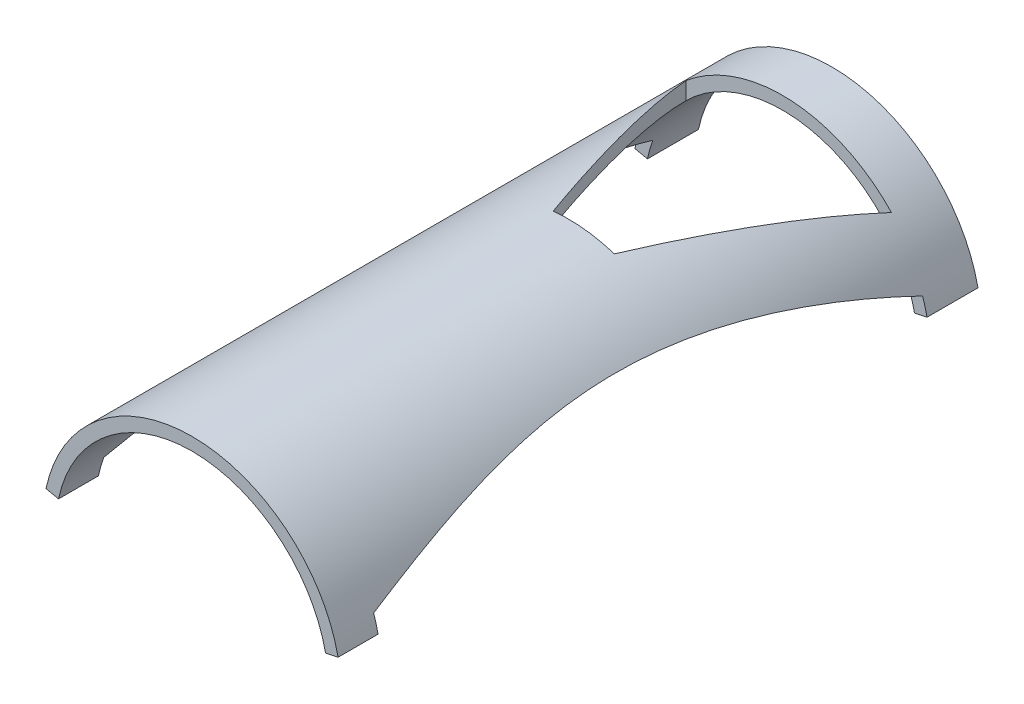
ISO-10303-21;
HEADER;
FILE_DESCRIPTION(('STEP AP214'),'2;1');
FILE_NAME('part.step','',(''),(''),'','','');
FILE_SCHEMA(('AUTOMOTIVE_DESIGN { 1 0 10303 214 1 1 1 1 }'));
ENDSEC;
DATA;
#1=APPLICATION_CONTEXT('core data for automotive mechanical design processes');
#2=APPLICATION_PROTOCOL_DEFINITION('international standard','automotive_design',2000,#1);
#3=PRODUCT_CONTEXT('',#1,'mechanical');
#4=PRODUCT('Part','Part','',(#3));
#5=PRODUCT_RELATED_PRODUCT_CATEGORY('part','',(#4));
#6=PRODUCT_DEFINITION_FORMATION('','',#4);
#7=PRODUCT_DEFINITION_CONTEXT('part definition',#1,'design');
#8=PRODUCT_DEFINITION('design','',#6,#7);
#9=PRODUCT_DEFINITION_SHAPE('','',#8);
#10=(LENGTH_UNIT() NAMED_UNIT(*) SI_UNIT(.MILLI.,.METRE.));
#11=(NAMED_UNIT(*) PLANE_ANGLE_UNIT() SI_UNIT($,.RADIAN.));
#12=(NAMED_UNIT(*) SI_UNIT($,.STERADIAN.) SOLID_ANGLE_UNIT());
#13=UNCERTAINTY_MEASURE_WITH_UNIT(LENGTH_MEASURE(1.E-05),#10,'distance_accuracy_value','');
#14=(GEOMETRIC_REPRESENTATION_CONTEXT(3) GLOBAL_UNCERTAINTY_ASSIGNED_CONTEXT((#13)) GLOBAL_UNIT_ASSIGNED_CONTEXT((#10,
#11,#12)) REPRESENTATION_CONTEXT('',''));
#15=CARTESIAN_POINT('',(0.,0.,0.));
#16=DIRECTION('',(0.,0.,1.));
#17=DIRECTION('',(1.,0.,0.));
#18=AXIS2_PLACEMENT_3D('',#15,#16,#17);
#19=CARTESIAN_POINT('',(-34.2351660256832,7.27690917862159,150.));
#20=DIRECTION('',(0.207911690817759,0.978147600733806,0.));
#21=DIRECTION('',(-0.978147600733806,0.207911690817759,0.));
#22=AXIS2_PLACEMENT_3D('',#19,#20,#21);
#23=PLANE('',#22);
#24=DIRECTION('',(0.,0.,-1.));
#25=VECTOR('',#24,1.);
#26=CARTESIAN_POINT('',(-31.3007232234818,6.65317410616831,150.));
#27=LINE('',#26,#25);
#28=CARTESIAN_POINT('',(-31.3007232234818,6.65317410616831,11.9530939235805));
#29=VERTEX_POINT('',#28);
#30=CARTESIAN_POINT('',(-31.3007232234818,6.65317410616831,0.));
#31=VERTEX_POINT('',#30);
#32=EDGE_CURVE('E255',#29,#31,#27,.T.);
#33=ORIENTED_EDGE('',*,*,#32,.F.);
#34=DIRECTION('',(-0.978147600733806,0.207911690817759,0.));
#35=VECTOR('',#34,1.);
#36=CARTESIAN_POINT('',(-34.2351660256832,7.27690917862159,11.9530939235805));
#37=LINE('',#36,#35);
#38=CARTESIAN_POINT('',(-34.2351660256832,7.27690917862159,11.9530939235805));
#39=VERTEX_POINT('',#38);
#40=EDGE_CURVE('E201',#29,#39,#37,.T.);
#41=ORIENTED_EDGE('',*,*,#40,.T.);
#42=DIRECTION('',(0.,0.,-1.));
#43=VECTOR('',#42,1.);
#44=CARTESIAN_POINT('',(-34.2351660256832,7.27690917862159,150.));
#45=LINE('',#44,#43);
#46=CARTESIAN_POINT('',(-34.2351660256832,7.27690917862159,0.));
#47=VERTEX_POINT('',#46);
#48=EDGE_CURVE('E268',#39,#47,#45,.T.);
#49=ORIENTED_EDGE('',*,*,#48,.T.);
#50=DIRECTION('',(0.978147600733806,-0.207911690817759,0.));
#51=VECTOR('',#50,1.);
#52=CARTESIAN_POINT('',(-34.2351660256832,7.27690917862159,0.));
#53=LINE('',#52,#51);
#54=EDGE_CURVE('E257',#47,#31,#53,.T.);
#55=ORIENTED_EDGE('',*,*,#54,.T.);
#56=EDGE_LOOP('',(#33,#41,#49,#55));
#57=FACE_BOUND('',#56,.T.);
#58=ADVANCED_FACE('F39',(#57),#23,.F.);
#59=CARTESIAN_POINT('',(31.3007232234818,6.65317410616831,150.));
#60=DIRECTION('',(-0.207911690817759,0.978147600733806,0.));
#61=DIRECTION('',(-0.978147600733806,-0.207911690817759,0.));
#62=AXIS2_PLACEMENT_3D('',#59,#60,#61);
#63=PLANE('',#62);
#64=DIRECTION('',(0.,0.,-1.));
#65=VECTOR('',#64,1.);
#66=CARTESIAN_POINT('',(34.2351660256832,7.27690917862159,150.));
#67=LINE('',#66,#65);
#68=CARTESIAN_POINT('',(34.2351660256832,7.27690917862159,11.9530939235805));
#69=VERTEX_POINT('',#68);
#70=CARTESIAN_POINT('',(34.2351660256832,7.27690917862159,0.));
#71=VERTEX_POINT('',#70);
#72=EDGE_CURVE('E298',#69,#71,#67,.T.);
#73=ORIENTED_EDGE('',*,*,#72,.F.);
#74=DIRECTION('',(-0.978147600733806,-0.207911690817759,0.));
#75=VECTOR('',#74,1.);
#76=CARTESIAN_POINT('',(31.3007232234818,6.65317410616831,11.9530939235805));
#77=LINE('',#76,#75);
#78=CARTESIAN_POINT('',(31.3007232234818,6.65317410616831,11.9530939235805));
#79=VERTEX_POINT('',#78);
#80=EDGE_CURVE('E227',#69,#79,#77,.T.);
#81=ORIENTED_EDGE('',*,*,#80,.T.);
#82=DIRECTION('',(0.,0.,-1.));
#83=VECTOR('',#82,1.);
#84=CARTESIAN_POINT('',(31.3007232234818,6.65317410616831,150.));
#85=LINE('',#84,#83);
#86=CARTESIAN_POINT('',(31.3007232234818,6.65317410616831,0.));
#87=VERTEX_POINT('',#86);
#88=EDGE_CURVE('E270',#79,#87,#85,.T.);
#89=ORIENTED_EDGE('',*,*,#88,.T.);
#90=DIRECTION('',(0.978147600733806,0.207911690817759,0.));
#91=VECTOR('',#90,1.);
#92=CARTESIAN_POINT('',(31.3007232234818,6.65317410616831,0.));
#93=LINE('',#92,#91);
#94=EDGE_CURVE('E312',#87,#71,#93,.T.);
#95=ORIENTED_EDGE('',*,*,#94,.T.);
#96=EDGE_LOOP('',(#73,#81,#89,#95));
#97=FACE_BOUND('',#96,.T.);
#98=ADVANCED_FACE('F245',(#97),#63,.F.);
#99=CARTESIAN_POINT('',(0.,0.,150.));
#100=DIRECTION('',(0.,0.,-1.));
#101=DIRECTION('',(-1.,0.,0.));
#102=AXIS2_PLACEMENT_3D('',#99,#100,#101);
#103=CYLINDRICAL_SURFACE('',#102,35.);
#104=CARTESIAN_POINT('',(33.2046490773948,11.0657706305103,140.636510433429));
#105=CARTESIAN_POINT('',(33.0532764336408,11.5199647534281,139.539531924796));
#106=CARTESIAN_POINT('',(32.8955467425113,11.9622148063761,138.438551105605));
#107=CARTESIAN_POINT('',(32.5697289345211,12.8228145565474,136.228854341505));
#108=CARTESIAN_POINT('',(32.4016412161139,13.2411651719449,135.120138695594));
#109=CARTESIAN_POINT('',(31.8854122211716,14.4602675983938,131.783030658858));
#110=CARTESIAN_POINT('',(31.5252540525955,15.2252185547421,129.543318192187));
#111=CARTESIAN_POINT('',(30.7904242921664,16.6613967718349,125.029465456095));
#112=CARTESIAN_POINT('',(30.415714927485,17.332355931446,122.755246420199));
#113=CARTESIAN_POINT('',(29.6714003315312,18.5777899882256,118.179587307883));
#114=CARTESIAN_POINT('',(29.3017952564287,19.1522619392639,115.878146402569));
#115=CARTESIAN_POINT('',(28.5913596708256,20.1972320746167,111.279519859467));
#116=CARTESIAN_POINT('',(28.2502176213313,20.6689845204681,108.982667652183));
#117=CARTESIAN_POINT('',(27.6098768074856,21.5169118242982,104.365361408686));
#118=CARTESIAN_POINT('',(27.3106778150004,21.8930872021423,102.044907500918));
#119=CARTESIAN_POINT('',(26.906903370342,22.3844405117167,98.5505490921763));
#120=CARTESIAN_POINT('',(26.7798833873723,22.535998968787,97.3842405521359));
#121=CARTESIAN_POINT('',(26.5427808275799,22.8147836156022,95.0470153437999));
#122=CARTESIAN_POINT('',(26.4326976088402,22.9420107275691,93.8760988518754));
#123=CARTESIAN_POINT('',(26.2313489633927,23.1719589414802,91.5302893374575));
#124=CARTESIAN_POINT('',(26.1400828540449,23.2746809324331,90.35539646079));
#125=CARTESIAN_POINT('',(25.9779886331242,23.455465915864,88.0023082988375));
#126=CARTESIAN_POINT('',(25.9071602491144,23.5335292370459,86.8241130577846));
#127=CARTESIAN_POINT('',(25.7958909566842,23.6553960836159,84.6352855066069));
#128=CARTESIAN_POINT('',(25.7525412809868,23.7025162655943,83.624983941683));
#129=CARTESIAN_POINT('',(25.6823673749474,23.7785343921254,81.6031243630142));
#130=CARTESIAN_POINT('',(25.6555430039085,23.8074324918213,80.5915663600402));
#131=CARTESIAN_POINT('',(25.6188014281703,23.8469650288753,78.5678112078323));
#132=CARTESIAN_POINT('',(25.608883803808,23.8575999195665,77.5556140750869));
#133=CARTESIAN_POINT('',(25.6060959705254,23.8605920696246,75.531166514253));
#134=CARTESIAN_POINT('',(25.6132258041536,23.8529492833725,74.5189160860377));
#135=CARTESIAN_POINT('',(25.6444361313408,23.8193916797705,72.4946561905714));
#136=CARTESIAN_POINT('',(25.6685220533122,23.7934710108375,71.482646904341));
#137=CARTESIAN_POINT('',(25.7333081420854,23.7233876034164,69.4597657009365));
#138=CARTESIAN_POINT('',(25.7740088095011,23.6792243152649,68.4488938189536));
#139=CARTESIAN_POINT('',(25.8714564347579,23.572716594113,66.4289043430169));
#140=CARTESIAN_POINT('',(25.9282030365474,23.5103725645337,65.4197867106371));
#141=CARTESIAN_POINT('',(26.0569600102666,23.3675841208154,63.403798349847));
#142=CARTESIAN_POINT('',(26.1289708642186,23.2871391350701,62.3969276934077));
#143=CARTESIAN_POINT('',(26.3665352298741,23.0187646522249,59.3801443467738));
#144=CARTESIAN_POINT('',(26.5536116006406,22.8038050929366,57.374239358492));
#145=CARTESIAN_POINT('',(26.9758531090951,22.3026956348501,53.3765596130217));
#146=CARTESIAN_POINT('',(27.2110193650542,22.0165440805364,51.3847851855366));
#147=CARTESIAN_POINT('',(27.7186300710471,21.373934285705,47.4176415788898));
#148=CARTESIAN_POINT('',(27.9910709351196,21.0174828068573,45.4422708409964));
#149=CARTESIAN_POINT('',(28.5618678164682,20.2349731025008,41.5091241061696));
#150=CARTESIAN_POINT('',(28.8602249391217,19.8089119073227,39.551348863651));
#151=CARTESIAN_POINT('',(29.5093742081075,18.8303765851985,35.4117881665667));
#152=CARTESIAN_POINT('',(29.8620700566164,18.2687682444044,33.2324576172323));
#153=CARTESIAN_POINT('',(30.5693319442945,17.0589213526471,28.8991881134835));
#154=CARTESIAN_POINT('',(30.9238972721528,16.4107137470145,26.7452403866027));
#155=CARTESIAN_POINT('',(31.6180394018998,15.0298040963613,22.4694897601109));
#156=CARTESIAN_POINT('',(31.9576587781619,14.2973668774225,20.3476086224144));
#157=CARTESIAN_POINT('',(32.4449022293486,13.1341224864333,17.1847107139915));
#158=CARTESIAN_POINT('',(32.6036545484304,12.7355061643378,16.1334821295929));
#159=CARTESIAN_POINT('',(32.9117287014795,11.916766704712,14.0379985101806));
#160=CARTESIAN_POINT('',(33.0610501802981,11.4966427583201,12.9937437391111));
#161=CARTESIAN_POINT('',(33.2046490773948,11.0657706305104,11.9530939235805));
#162=B_SPLINE_CURVE_WITH_KNOTS('',3,(#104,#105,#106,#107,#108,#109,#110,#111,#112,#113,#114,
#115,#116,#117,#118,#119,#120,#121,#122,#123,#124,#125,#126,#127,#128,#129,#130,#131,#132,#133,
#134,#135,#136,#137,#138,#139,#140,#141,#142,#143,#144,#145,#146,#147,#148,#149,#150,#151,#152,
#153,#154,#155,#156,#157,#158,#159,#160,#161),.UNSPECIFIED.,.F.,.F.,(4,2,2,2,2,2,2,2,2,2,2,2,2,
2,2,2,2,2,2,2,2,2,2,2,2,2,2,2,4),(0.,3.59050809061059,7.18087814734327,14.3604437854447,
21.5600885870374,28.7599531818799,35.8662447391547,42.9724976428745,46.5210462759864,
50.0694603830897,53.6177457395142,57.1659837947337,60.2026823050441,63.2393549604758,
66.2759522378803,69.3125570942847,72.3501345478954,75.3878035326021,78.4254051181619,
81.4631026409528,87.5390358214239,93.6151103063026,99.6906006598108,105.766350271819,
112.598488529975,119.428191893536,126.236980650649,129.643010400798,133.04916833962),.UNSPECIFIED.);
#163=CARTESIAN_POINT('',(33.2046490773948,11.0657706305103,140.636510433429));
#164=VERTEX_POINT('',#163);
#165=CARTESIAN_POINT('',(33.2046490773948,11.0657706305103,11.9530939235805));
#166=VERTEX_POINT('',#165);
#167=EDGE_CURVE('E187',#164,#166,#162,.T.);
#168=ORIENTED_EDGE('',*,*,#167,.T.);
#169=CARTESIAN_POINT('',(0.,0.,11.9530939235805));
#170=DIRECTION('',(0.,0.,-1.));
#171=DIRECTION('',(-1.,0.,0.));
#172=AXIS2_PLACEMENT_3D('',#169,#170,#171);
#173=CIRCLE('',#172,35.);
#174=EDGE_CURVE('E195',#166,#69,#173,.T.);
#175=ORIENTED_EDGE('',*,*,#174,.T.);
#176=ORIENTED_EDGE('',*,*,#72,.T.);
#177=CARTESIAN_POINT('',(0.,0.,0.));
#178=DIRECTION('',(0.,0.,1.));
#179=DIRECTION('',(1.,0.,0.));
#180=AXIS2_PLACEMENT_3D('',#177,#178,#179);
#181=CIRCLE('',#180,35.);
#182=EDGE_CURVE('E320',#71,#47,#181,.T.);
#183=ORIENTED_EDGE('',*,*,#182,.T.);
#184=ORIENTED_EDGE('',*,*,#48,.F.);
#185=CARTESIAN_POINT('',(-33.2046490773948,11.0657706305103,11.9530939235805));
#186=VERTEX_POINT('',#185);
#187=EDGE_CURVE('E185',#39,#186,#173,.T.);
#188=ORIENTED_EDGE('',*,*,#187,.T.);
#189=CARTESIAN_POINT('',(-33.2046490773948,11.0657706305103,11.9530939235805));
#190=CARTESIAN_POINT('',(-33.0532764336408,11.5199647534281,13.0500724322133));
#191=CARTESIAN_POINT('',(-32.8955467425113,11.9622148063761,14.1510532514048));
#192=CARTESIAN_POINT('',(-32.5697289345211,12.8228145565474,16.3607500155046));
#193=CARTESIAN_POINT('',(-32.4016412161139,13.2411651719449,17.4694656614157));
#194=CARTESIAN_POINT('',(-31.8854122211716,14.4602675983939,20.8065736981517));
#195=CARTESIAN_POINT('',(-31.5252540525955,15.2252185547421,23.0462861648228));
#196=CARTESIAN_POINT('',(-30.7904242921664,16.6613967718349,27.5601389009139));
#197=CARTESIAN_POINT('',(-30.415714927485,17.332355931446,29.8343579368101));
#198=CARTESIAN_POINT('',(-29.6714003315312,18.5777899882256,34.4100170491263));
#199=CARTESIAN_POINT('',(-29.3017952564287,19.1522619392638,36.7114579544401));
#200=CARTESIAN_POINT('',(-28.5913596708256,20.1972320746167,41.3100844975427));
#201=CARTESIAN_POINT('',(-28.2502176213312,20.6689845204682,43.6069367048261));
#202=CARTESIAN_POINT('',(-27.6098768074856,21.5169118242983,48.2242429483236));
#203=CARTESIAN_POINT('',(-27.3106778150004,21.8930872021422,50.5446968560911));
#204=CARTESIAN_POINT('',(-26.906903370342,22.3844405117168,54.039055264833));
#205=CARTESIAN_POINT('',(-26.7798833873722,22.5359989687871,55.2053638048735));
#206=CARTESIAN_POINT('',(-26.5427808275799,22.8147836156022,57.5425890132094));
#207=CARTESIAN_POINT('',(-26.4326976088403,22.9420107275691,58.7135055051339));
#208=CARTESIAN_POINT('',(-26.2313489633928,23.1719589414801,61.0593150195519));
#209=CARTESIAN_POINT('',(-26.1400828540449,23.2746809324331,62.2342078962194));
#210=CARTESIAN_POINT('',(-25.9779886331243,23.455465915864,64.5872960581719));
#211=CARTESIAN_POINT('',(-25.9071602491144,23.5335292370459,65.7654912992247));
#212=CARTESIAN_POINT('',(-25.7958909566842,23.6553960836159,67.9543188504024));
#213=CARTESIAN_POINT('',(-25.7525412809868,23.7025162655943,68.9646204153264));
#214=CARTESIAN_POINT('',(-25.6823673749474,23.7785343921254,70.9864799939951));
#215=CARTESIAN_POINT('',(-25.6555430039085,23.8074324918214,71.9980379969691));
#216=CARTESIAN_POINT('',(-25.6188014281703,23.8469650288753,74.0217931491771));
#217=CARTESIAN_POINT('',(-25.608883803808,23.8575999195665,75.0339902819225));
#218=CARTESIAN_POINT('',(-25.6060959705254,23.8605920696246,77.0584378427564));
#219=CARTESIAN_POINT('',(-25.6132258041536,23.8529492833725,78.0706882709716));
#220=CARTESIAN_POINT('',(-25.6444361313408,23.8193916797705,80.0949481664379));
#221=CARTESIAN_POINT('',(-25.6685220533122,23.7934710108375,81.1069574526683));
#222=CARTESIAN_POINT('',(-25.7333081420854,23.7233876034164,83.1298386560728));
#223=CARTESIAN_POINT('',(-25.774008809501,23.6792243152649,84.1407105380558));
#224=CARTESIAN_POINT('',(-25.8714564347579,23.5727165941131,86.1607000139924));
#225=CARTESIAN_POINT('',(-25.9282030365474,23.5103725645337,87.1698176463723));
#226=CARTESIAN_POINT('',(-26.0569600102666,23.3675841208154,89.1858060071624));
#227=CARTESIAN_POINT('',(-26.1289708642186,23.2871391350701,90.1926766636016));
#228=CARTESIAN_POINT('',(-26.3665352298741,23.018764652225,93.2094600102356));
#229=CARTESIAN_POINT('',(-26.5536116006406,22.8038050929366,95.2153649985173));
#230=CARTESIAN_POINT('',(-26.9758531090951,22.3026956348501,99.2130447439876));
#231=CARTESIAN_POINT('',(-27.2110193650542,22.0165440805364,101.204819171473));
#232=CARTESIAN_POINT('',(-27.7186300710471,21.373934285705,105.17196277812));
#233=CARTESIAN_POINT('',(-27.9910709351196,21.0174828068573,107.147333516013));
#234=CARTESIAN_POINT('',(-28.5618678164682,20.2349731025008,111.08048025084));
#235=CARTESIAN_POINT('',(-28.8602249391217,19.8089119073227,113.038255493358));
#236=CARTESIAN_POINT('',(-29.5093742081075,18.8303765851985,117.177816190443));
#237=CARTESIAN_POINT('',(-29.8620700566164,18.2687682444044,119.357146739777));
#238=CARTESIAN_POINT('',(-30.5693319442945,17.0589213526471,123.690416243526));
#239=CARTESIAN_POINT('',(-30.9238972721528,16.4107137470145,125.844363970407));
#240=CARTESIAN_POINT('',(-31.6180394018998,15.0298040963613,130.120114596898));
#241=CARTESIAN_POINT('',(-31.9576587781619,14.2973668774225,132.241995734595));
#242=CARTESIAN_POINT('',(-32.4449022293486,13.1341224864333,135.404893643018));
#243=CARTESIAN_POINT('',(-32.6036545484304,12.7355061643378,136.456122227416));
#244=CARTESIAN_POINT('',(-32.9117287014795,11.916766704712,138.551605846829));
#245=CARTESIAN_POINT('',(-33.0610501802981,11.4966427583201,139.595860617898));
#246=CARTESIAN_POINT('',(-33.2046490773948,11.0657706305103,140.636510433429));
#247=B_SPLINE_CURVE_WITH_KNOTS('',3,(#189,#190,#191,#192,#193,#194,#195,#196,#197,#198,#199,
#200,#201,#202,#203,#204,#205,#206,#207,#208,#209,#210,#211,#212,#213,#214,#215,#216,#217,#218,
#219,#220,#221,#222,#223,#224,#225,#226,#227,#228,#229,#230,#231,#232,#233,#234,#235,#236,#237,
#238,#239,#240,#241,#242,#243,#244,#245,#246),.UNSPECIFIED.,.F.,.F.,(4,2,2,2,2,2,2,2,2,2,2,2,2,
2,2,2,2,2,2,2,2,2,2,2,2,2,2,2,4),(0.,3.59050809061058,7.18087814734327,14.3604437854447,
21.5600885870373,28.7599531818798,35.8662447391546,42.9724976428745,46.5210462759864,
50.0694603830896,53.6177457395142,57.1659837947337,60.2026823050441,63.2393549604758,
66.2759522378802,69.3125570942847,72.3501345478954,75.3878035326021,78.4254051181619,
81.4631026409529,87.5390358214239,93.6151103063026,99.6906006598108,105.766350271819,
112.598488529975,119.428191893536,126.236980650649,129.643010400798,133.04916833962),.UNSPECIFIED.);
#248=CARTESIAN_POINT('',(-33.2046490773948,11.0657706305103,140.636510433429));
#249=VERTEX_POINT('',#248);
#250=EDGE_CURVE('E175',#186,#249,#247,.T.);
#251=ORIENTED_EDGE('',*,*,#250,.T.);
#252=CARTESIAN_POINT('',(0.,0.,140.636510433429));
#253=DIRECTION('',(0.,0.,1.));
#254=DIRECTION('',(1.,0.,0.));
#255=AXIS2_PLACEMENT_3D('',#252,#253,#254);
#256=CIRCLE('',#255,35.);
#257=CARTESIAN_POINT('',(-34.2351660256832,7.27690917862159,140.636510433429));
#258=VERTEX_POINT('',#257);
#259=EDGE_CURVE('E160',#249,#258,#256,.T.);
#260=ORIENTED_EDGE('',*,*,#259,.T.);
#261=CARTESIAN_POINT('',(-34.2351660256832,7.27690917862159,150.));
#262=VERTEX_POINT('',#261);
#263=EDGE_CURVE('E274',#262,#258,#45,.T.);
#264=ORIENTED_EDGE('',*,*,#263,.F.);
#265=CARTESIAN_POINT('',(0.,0.,150.));
#266=DIRECTION('',(0.,0.,1.));
#267=DIRECTION('',(1.,0.,0.));
#268=AXIS2_PLACEMENT_3D('',#265,#266,#267);
#269=CIRCLE('',#268,35.);
#270=CARTESIAN_POINT('',(34.2351660256832,7.27690917862159,150.));
#271=VERTEX_POINT('',#270);
#272=EDGE_CURVE('E315',#271,#262,#269,.T.);
#273=ORIENTED_EDGE('',*,*,#272,.F.);
#274=CARTESIAN_POINT('',(34.2351660256832,7.27690917862159,140.636510433429));
#275=VERTEX_POINT('',#274);
#276=EDGE_CURVE('E306',#271,#275,#67,.T.);
#277=ORIENTED_EDGE('',*,*,#276,.T.);
#278=EDGE_CURVE('E70',#275,#164,#256,.T.);
#279=ORIENTED_EDGE('',*,*,#278,.T.);
#280=EDGE_LOOP('',(#168,#175,#176,#183,#184,#188,#251,#260,#264,#273,#277,#279));
#281=FACE_BOUND('',#280,.T.);
#282=CARTESIAN_POINT('',(0.,0.,11.5546932532715));
#283=DIRECTION('',(0.,0.,1.));
#284=DIRECTION('',(1.,0.,0.));
#285=AXIS2_PLACEMENT_3D('',#282,#283,#284);
#286=CIRCLE('',#285,35.);
#287=CARTESIAN_POINT('',(25.4976428997842,23.9764510834086,11.5546932532715));
#288=VERTEX_POINT('',#287);
#289=CARTESIAN_POINT('',(-22.7088382076203,26.6328494018219,11.5546932532715));
#290=VERTEX_POINT('',#289);
#291=EDGE_CURVE('E344',#288,#290,#286,.T.);
#292=ORIENTED_EDGE('',*,*,#291,.F.);
#293=CARTESIAN_POINT('',(0.,0.,98.3845042092934));
#294=DIRECTION('',(-0.959486670527062,0.,-0.281754022297629));
#295=DIRECTION('',(0.281754022297629,0.,-0.959486670527062));
#296=AXIS2_PLACEMENT_3D('',#293,#294,#295);
#297=ELLIPSE('',#296,124.221829078372,35.);
#298=CARTESIAN_POINT('',(10.7568180983465,33.3060184411029,61.7531777122216));
#299=VERTEX_POINT('',#298);
#300=EDGE_CURVE('E341',#299,#288,#297,.T.);
#301=ORIENTED_EDGE('',*,*,#300,.F.);
#302=CARTESIAN_POINT('',(0.,0.,61.7531777122216));
#303=DIRECTION('',(0.,0.,-1.));
#304=DIRECTION('',(-1.,0.,0.));
#305=AXIS2_PLACEMENT_3D('',#302,#303,#304);
#306=CIRCLE('',#305,35.);
#307=CARTESIAN_POINT('',(-3.58560603278213,34.8158502607315,61.7531777122216));
#308=VERTEX_POINT('',#307);
#309=EDGE_CURVE('E338',#308,#299,#306,.T.);
#310=ORIENTED_EDGE('',*,*,#309,.F.);
#311=CARTESIAN_POINT('',(0.,0.,71.1653935482747));
#312=DIRECTION('',(0.934487734928968,0.,-0.355995327591988));
#313=DIRECTION('',(-0.355995327591988,0.,-0.934487734928968));
#314=AXIS2_PLACEMENT_3D('',#311,#312,#313);
#315=ELLIPSE('',#314,98.3158971123185,35.);
#316=EDGE_CURVE('E324',#290,#308,#315,.T.);
#317=ORIENTED_EDGE('',*,*,#316,.F.);
#318=EDGE_LOOP('',(#292,#301,#310,#317));
#319=FACE_BOUND('',#318,.T.);
#320=ADVANCED_FACE('F41',(#281,#319),#103,.T.);
#321=CARTESIAN_POINT('',(0.,0.,150.));
#322=DIRECTION('',(0.,0.,-1.));
#323=DIRECTION('',(-1.,0.,0.));
#324=AXIS2_PLACEMENT_3D('',#321,#322,#323);
#325=CYLINDRICAL_SURFACE('',#324,32.);
#326=CARTESIAN_POINT('',(-30.0258009110987,11.0657706305103,140.636510433429));
#327=CARTESIAN_POINT('',(-29.8586573853052,11.5192734962577,139.541200983048));
#328=CARTESIAN_POINT('',(-29.6842806127991,11.9607858336793,138.44210250506));
#329=CARTESIAN_POINT('',(-29.3235179154583,12.8198459750017,136.236593620417));
#330=CARTESIAN_POINT('',(-29.1371325718386,13.2373949368837,135.130183569966));
#331=CARTESIAN_POINT('',(-28.5637094255284,14.4540040596603,131.80072253757));
#332=CARTESIAN_POINT('',(-28.1623275086501,15.217229388798,129.566950272191));
#333=CARTESIAN_POINT('',(-27.3393302241916,16.6507168357587,125.064495359258));
#334=CARTESIAN_POINT('',(-26.917647262066,17.3206346442035,122.795716031756));
#335=CARTESIAN_POINT('',(-26.0754587872309,18.5643303305162,118.231579095762));
#336=CARTESIAN_POINT('',(-25.6549533314295,19.1381036380176,115.936220229315));
#337=CARTESIAN_POINT('',(-24.8435159648057,20.1798913981738,111.359875676757));
#338=CARTESIAN_POINT('',(-24.4521955734081,20.6495793177637,109.079340186606));
#339=CARTESIAN_POINT('',(-23.7125393460342,21.4949139207797,104.493712649819));
#340=CARTESIAN_POINT('',(-23.3642035551674,21.8705605055161,102.188620577417));
#341=CARTESIAN_POINT('',(-22.8907220462364,22.3621648921368,98.7163822199746));
#342=CARTESIAN_POINT('',(-22.7411722315528,22.5139562638419,97.557533212831));
#343=CARTESIAN_POINT('',(-22.4609063184523,22.7935717503738,95.2346925274496));
#344=CARTESIAN_POINT('',(-22.3301894017456,22.9213969066061,94.0707010749174));
#345=CARTESIAN_POINT('',(-22.0900951575564,23.1528726987712,91.7381934242287));
#346=CARTESIAN_POINT('',(-21.980716429813,23.2565249210746,90.5696775281121));
#347=CARTESIAN_POINT('',(-21.7855287996959,23.4394682530733,88.2287765168062));
#348=CARTESIAN_POINT('',(-21.6997194309723,23.5187598447784,87.0563914786374));
#349=CARTESIAN_POINT('',(-21.5663870219902,23.6410149152747,84.9152345056177));
#350=CARTESIAN_POINT('',(-21.5147837636001,23.687915854909,83.9469387219337));
#351=CARTESIAN_POINT('',(-21.4296247312552,23.7649847838871,82.0088931869141));
#352=CARTESIAN_POINT('',(-21.3960687116521,23.795153000987,81.0391434555489));
#353=CARTESIAN_POINT('',(-21.3475351335102,23.8387039741499,79.0988300063967));
#354=CARTESIAN_POINT('',(-21.3325570240868,23.8520872279321,78.1282663136));
#355=CARTESIAN_POINT('',(-21.3214167832116,23.8620460917791,76.1869411665884));
#356=CARTESIAN_POINT('',(-21.3252547049698,23.8586216543135,75.2161797118221));
#357=CARTESIAN_POINT('',(-21.3516900691578,23.8349668534249,73.2747679791176));
#358=CARTESIAN_POINT('',(-21.3742942770236,23.8147304291088,72.3041178675544));
#359=CARTESIAN_POINT('',(-21.4379095781381,23.7574799574971,70.363921039539));
#360=CARTESIAN_POINT('',(-21.4789206647578,23.7204659162438,69.3943743226896));
#361=CARTESIAN_POINT('',(-21.5787113619441,23.629722301472,67.4569802325663));
#362=CARTESIAN_POINT('',(-21.6374909547305,23.5759927446801,66.4891328575928));
#363=CARTESIAN_POINT('',(-21.7719198378158,23.4519038130336,64.5556674720958));
#364=CARTESIAN_POINT('',(-21.8475697183154,23.3815438563653,63.5900495407631));
#365=CARTESIAN_POINT('',(-22.0983201691025,23.1455717936963,60.6961520832489));
#366=CARTESIAN_POINT('',(-22.2971659073516,22.9551162929356,58.7718677957742));
#367=CARTESIAN_POINT('',(-22.7475031117744,22.5089111679025,54.9372380474604));
#368=CARTESIAN_POINT('',(-22.9989958078703,22.2531600181823,53.0268929133427));
#369=CARTESIAN_POINT('',(-23.5426316016123,21.677204401555,49.221629961657));
#370=CARTESIAN_POINT('',(-23.8347787420459,21.3569935231825,47.3267136982389));
#371=CARTESIAN_POINT('',(-24.4474334949458,20.6528622434669,43.5535588220292));
#372=CARTESIAN_POINT('',(-24.7679398797311,20.2689445993813,41.6753194911573));
#373=CARTESIAN_POINT('',(-25.5155255179072,19.3239094665493,37.4230588285926));
#374=CARTESIAN_POINT('',(-25.9477303734132,18.7430684891071,35.0543045276021));
#375=CARTESIAN_POINT('',(-26.8152085548045,17.4794697375481,30.3458953578438));
#376=CARTESIAN_POINT('',(-27.2504805164203,16.7967548491894,28.0062286909225));
#377=CARTESIAN_POINT('',(-28.1006988639183,15.3318453333472,23.3639459806351));
#378=CARTESIAN_POINT('',(-28.5157133139774,14.5500209221213,21.0612262521706));
#379=CARTESIAN_POINT('',(-29.1083697407062,13.3009563004573,17.6291901537772));
#380=CARTESIAN_POINT('',(-29.3009971787711,12.871741090677,16.488516107006));
#381=CARTESIAN_POINT('',(-29.6735779557878,11.9878543944428,14.2149183394562));
#382=CARTESIAN_POINT('',(-29.8535305885977,11.5331814922123,13.0819950536597));
#383=CARTESIAN_POINT('',(-30.0258009110987,11.0657706305103,11.9530939235805));
#384=B_SPLINE_CURVE_WITH_KNOTS('',3,(#326,#327,#328,#329,#330,#331,#332,#333,#334,#335,#336,
#337,#338,#339,#340,#341,#342,#343,#344,#345,#346,#347,#348,#349,#350,#351,#352,#353,#354,#355,
#356,#357,#358,#359,#360,#361,#362,#363,#364,#365,#366,#367,#368,#369,#370,#371,#372,#373,#374,
#375,#376,#377,#378,#379,#380,#381,#382,#383),.UNSPECIFIED.,.F.,.F.,(4,2,2,2,2,2,2,2,2,2,2,2,2,
2,2,2,2,2,2,2,2,2,2,2,2,2,2,2,4),(0.,3.59141881898543,7.18266394359911,14.36354683591,
21.5702627034266,28.7773210553653,35.8583900352002,42.9394664460833,46.4739650950469,
50.0083101236195,53.5424231422961,57.0764662289878,59.9885809863497,62.9006561047376,
65.8126448702479,68.7246418705916,71.6376891314153,74.5507353431369,77.4637786398999,
80.3769238644181,86.2063356472909,92.0358836303099,97.8660117341187,103.695887573146,
111.124248026009,118.549490145713,125.947770905425,129.649113335561,133.350661812997),.UNSPECIFIED.);
#385=CARTESIAN_POINT('',(-30.0258009110987,11.0657706305103,140.636510433429));
#386=VERTEX_POINT('',#385);
#387=CARTESIAN_POINT('',(-30.0258009110987,11.0657706305103,11.9530939235805));
#388=VERTEX_POINT('',#387);
#389=EDGE_CURVE('E11',#386,#388,#384,.T.);
#390=ORIENTED_EDGE('',*,*,#389,.T.);
#391=CARTESIAN_POINT('',(0.,0.,11.9530939235805));
#392=DIRECTION('',(0.,0.,-1.));
#393=DIRECTION('',(-1.,0.,0.));
#394=AXIS2_PLACEMENT_3D('',#391,#392,#393);
#395=CIRCLE('',#394,32.);
#396=EDGE_CURVE('E193',#388,#29,#395,.F.);
#397=ORIENTED_EDGE('',*,*,#396,.T.);
#398=ORIENTED_EDGE('',*,*,#32,.T.);
#399=CARTESIAN_POINT('',(0.,0.,0.));
#400=DIRECTION('',(0.,0.,-1.));
#401=DIRECTION('',(1.,0.,0.));
#402=AXIS2_PLACEMENT_3D('',#399,#400,#401);
#403=CIRCLE('',#402,32.);
#404=EDGE_CURVE('E303',#31,#87,#403,.T.);
#405=ORIENTED_EDGE('',*,*,#404,.T.);
#406=ORIENTED_EDGE('',*,*,#88,.F.);
#407=CARTESIAN_POINT('',(30.0258009110987,11.0657706305103,11.9530939235805));
#408=VERTEX_POINT('',#407);
#409=EDGE_CURVE('E170',#79,#408,#395,.F.);
#410=ORIENTED_EDGE('',*,*,#409,.T.);
#411=CARTESIAN_POINT('',(30.0258009110987,11.0657706305103,11.9530939235805));
#412=CARTESIAN_POINT('',(29.8586573853052,11.5192734962578,13.0484033739613));
#413=CARTESIAN_POINT('',(29.6842806127991,11.9607858336793,14.1475018519496));
#414=CARTESIAN_POINT('',(29.3235179154583,12.8198459750017,16.3530107365922));
#415=CARTESIAN_POINT('',(29.1371325718386,13.2373949368837,17.4594207870436));
#416=CARTESIAN_POINT('',(28.5637094255284,14.4540040596603,20.7888818194394));
#417=CARTESIAN_POINT('',(28.1623275086501,15.217229388798,23.0226540848182));
#418=CARTESIAN_POINT('',(27.3393302241916,16.6507168357587,27.5251089977515));
#419=CARTESIAN_POINT('',(26.917647262066,17.3206346442035,29.7938883252528));
#420=CARTESIAN_POINT('',(26.0754587872309,18.5643303305162,34.358025261247));
#421=CARTESIAN_POINT('',(25.6549533314295,19.1381036380176,36.6533841276944));
#422=CARTESIAN_POINT('',(24.8435159648058,20.1798913981738,41.2297286802527));
#423=CARTESIAN_POINT('',(24.4521955734081,20.6495793177637,43.5102641704037));
#424=CARTESIAN_POINT('',(23.7125393460342,21.4949139207797,48.0958917071899));
#425=CARTESIAN_POINT('',(23.3642035551674,21.8705605055161,50.4009837795927));
#426=CARTESIAN_POINT('',(22.8907220462364,22.3621648921368,53.8732221370347));
#427=CARTESIAN_POINT('',(22.7411722315528,22.5139562638419,55.0320711441783));
#428=CARTESIAN_POINT('',(22.4609063184524,22.7935717503738,57.3549118295597));
#429=CARTESIAN_POINT('',(22.3301894017456,22.921396906606,58.5189032820919));
#430=CARTESIAN_POINT('',(22.0900951575564,23.1528726987711,60.8514109327806));
#431=CARTESIAN_POINT('',(21.980716429813,23.2565249210746,62.0199268288972));
#432=CARTESIAN_POINT('',(21.7855287996959,23.4394682530733,64.3608278402031));
#433=CARTESIAN_POINT('',(21.6997194309723,23.5187598447784,65.533212878372));
#434=CARTESIAN_POINT('',(21.5663870219902,23.6410149152747,67.6743698513917));
#435=CARTESIAN_POINT('',(21.5147837636001,23.6879158549089,68.6426656350757));
#436=CARTESIAN_POINT('',(21.4296247312552,23.7649847838871,70.5807111700953));
#437=CARTESIAN_POINT('',(21.3960687116521,23.795153000987,71.5504609014605));
#438=CARTESIAN_POINT('',(21.3475351335102,23.8387039741499,73.4907743506126));
#439=CARTESIAN_POINT('',(21.3325570240868,23.8520872279321,74.4613380434094));
#440=CARTESIAN_POINT('',(21.3214167832116,23.8620460917791,76.402663190421));
#441=CARTESIAN_POINT('',(21.3252547049698,23.8586216543135,77.3734246451873));
#442=CARTESIAN_POINT('',(21.3516900691578,23.8349668534249,79.3148363778918));
#443=CARTESIAN_POINT('',(21.3742942770236,23.8147304291088,80.285486489455));
#444=CARTESIAN_POINT('',(21.4379095781381,23.7574799574972,82.2256833174703));
#445=CARTESIAN_POINT('',(21.4789206647578,23.7204659162438,83.1952300343197));
#446=CARTESIAN_POINT('',(21.5787113619441,23.629722301472,85.1326241244431));
#447=CARTESIAN_POINT('',(21.6374909547306,23.5759927446801,86.1004714994166));
#448=CARTESIAN_POINT('',(21.7719198378158,23.4519038130335,88.0339368849135));
#449=CARTESIAN_POINT('',(21.8475697183154,23.3815438563653,88.9995548162463));
#450=CARTESIAN_POINT('',(22.0983201691024,23.1455717936963,91.8934522737605));
#451=CARTESIAN_POINT('',(22.2971659073515,22.9551162929356,93.8177365612352));
#452=CARTESIAN_POINT('',(22.7475031117744,22.5089111679025,97.652366309549));
#453=CARTESIAN_POINT('',(22.9989958078703,22.2531600181823,99.5627114436667));
#454=CARTESIAN_POINT('',(23.5426316016122,21.677204401555,103.367974395352));
#455=CARTESIAN_POINT('',(23.8347787420459,21.3569935231825,105.26289065877));
#456=CARTESIAN_POINT('',(24.4474334949458,20.6528622434669,109.03604553498));
#457=CARTESIAN_POINT('',(24.7679398797311,20.2689445993813,110.914284865852));
#458=CARTESIAN_POINT('',(25.5155255179072,19.3239094665493,115.166545528417));
#459=CARTESIAN_POINT('',(25.9477303734132,18.7430684891071,117.535299829407));
#460=CARTESIAN_POINT('',(26.8152085548045,17.4794697375481,122.243708999166));
#461=CARTESIAN_POINT('',(27.2504805164203,16.7967548491894,124.583375666087));
#462=CARTESIAN_POINT('',(28.1006988639183,15.3318453333472,129.225658376374));
#463=CARTESIAN_POINT('',(28.5157133139774,14.5500209221213,131.528378104839));
#464=CARTESIAN_POINT('',(29.1083697407062,13.3009563004573,134.960414203232));
#465=CARTESIAN_POINT('',(29.3009971787711,12.871741090677,136.101088250003));
#466=CARTESIAN_POINT('',(29.6735779557879,11.9878543944427,138.374686017553));
#467=CARTESIAN_POINT('',(29.8535305885977,11.5331814922123,139.50760930335));
#468=CARTESIAN_POINT('',(30.0258009110987,11.0657706305103,140.636510433429));
#469=B_SPLINE_CURVE_WITH_KNOTS('',3,(#411,#412,#413,#414,#415,#416,#417,#418,#419,#420,#421,
#422,#423,#424,#425,#426,#427,#428,#429,#430,#431,#432,#433,#434,#435,#436,#437,#438,#439,#440,
#441,#442,#443,#444,#445,#446,#447,#448,#449,#450,#451,#452,#453,#454,#455,#456,#457,#458,#459,
#460,#461,#462,#463,#464,#465,#466,#467,#468),.UNSPECIFIED.,.F.,.F.,(4,2,2,2,2,2,2,2,2,2,2,2,2,
2,2,2,2,2,2,2,2,2,2,2,2,2,2,2,4),(0.,3.59141881898543,7.18266394359912,14.36354683591,
21.5702627034265,28.7773210553652,35.8583900352002,42.9394664460832,46.4739650950468,
50.0083101236194,53.5424231422961,57.0764662289878,59.9885809863497,62.9006561047376,
65.8126448702479,68.7246418705916,71.6376891314153,74.5507353431368,77.4637786398999,
80.3769238644181,86.2063356472909,92.0358836303099,97.8660117341187,103.695887573146,
111.124248026009,118.549490145713,125.947770905425,129.649113335561,133.350661812997),.UNSPECIFIED.);
#470=CARTESIAN_POINT('',(30.0258009110987,11.0657706305103,140.636510433429));
#471=VERTEX_POINT('',#470);
#472=EDGE_CURVE('E55',#408,#471,#469,.T.);
#473=ORIENTED_EDGE('',*,*,#472,.T.);
#474=CARTESIAN_POINT('',(0.,0.,140.636510433429));
#475=DIRECTION('',(0.,0.,1.));
#476=DIRECTION('',(1.,0.,0.));
#477=AXIS2_PLACEMENT_3D('',#474,#475,#476);
#478=CIRCLE('',#477,32.);
#479=CARTESIAN_POINT('',(31.3007232234818,6.65317410616831,140.636510433429));
#480=VERTEX_POINT('',#479);
#481=EDGE_CURVE('E463',#471,#480,#478,.F.);
#482=ORIENTED_EDGE('',*,*,#481,.T.);
#483=CARTESIAN_POINT('',(31.3007232234818,6.65317410616831,150.));
#484=VERTEX_POINT('',#483);
#485=EDGE_CURVE('E263',#484,#480,#85,.T.);
#486=ORIENTED_EDGE('',*,*,#485,.F.);
#487=CARTESIAN_POINT('',(0.,0.,150.));
#488=DIRECTION('',(0.,0.,-1.));
#489=DIRECTION('',(1.,0.,0.));
#490=AXIS2_PLACEMENT_3D('',#487,#488,#489);
#491=CIRCLE('',#490,32.);
#492=CARTESIAN_POINT('',(-31.3007232234818,6.65317410616831,150.));
#493=VERTEX_POINT('',#492);
#494=EDGE_CURVE('E327',#493,#484,#491,.T.);
#495=ORIENTED_EDGE('',*,*,#494,.F.);
#496=CARTESIAN_POINT('',(-31.3007232234818,6.65317410616831,140.636510433429));
#497=VERTEX_POINT('',#496);
#498=EDGE_CURVE('E262',#493,#497,#27,.T.);
#499=ORIENTED_EDGE('',*,*,#498,.T.);
#500=EDGE_CURVE('E62',#497,#386,#478,.F.);
#501=ORIENTED_EDGE('',*,*,#500,.T.);
#502=EDGE_LOOP('',(#390,#397,#398,#405,#406,#410,#473,#482,#486,#495,#499,#501));
#503=FACE_BOUND('',#502,.T.);
#504=CARTESIAN_POINT('',(0.,0.,71.1653935482747));
#505=DIRECTION('',(0.934487734928968,0.,-0.355995327591988));
#506=DIRECTION('',(-0.355995327591988,0.,-0.934487734928968));
#507=AXIS2_PLACEMENT_3D('',#504,#505,#506);
#508=ELLIPSE('',#507,89.8888202169769,32.);
#509=CARTESIAN_POINT('',(-3.58560603278213,31.798481557736,61.7531777122216));
#510=VERTEX_POINT('',#509);
#511=CARTESIAN_POINT('',(-22.7088382076203,22.545701746899,11.5546932532715));
#512=VERTEX_POINT('',#511);
#513=EDGE_CURVE('E286',#510,#512,#508,.F.);
#514=ORIENTED_EDGE('',*,*,#513,.F.);
#515=CARTESIAN_POINT('',(0.,0.,61.7531777122216));
#516=DIRECTION('',(0.,0.,-1.));
#517=DIRECTION('',(-1.,0.,0.));
#518=AXIS2_PLACEMENT_3D('',#515,#516,#517);
#519=CIRCLE('',#518,32.);
#520=CARTESIAN_POINT('',(10.7568180983465,30.1378642972439,61.7531777122216));
#521=VERTEX_POINT('',#520);
#522=EDGE_CURVE('E283',#521,#510,#519,.F.);
#523=ORIENTED_EDGE('',*,*,#522,.F.);
#524=CARTESIAN_POINT('',(0.,0.,98.3845042092934));
#525=DIRECTION('',(-0.959486670527062,0.,-0.281754022297629));
#526=DIRECTION('',(0.281754022297629,0.,-0.959486670527062));
#527=AXIS2_PLACEMENT_3D('',#524,#525,#526);
#528=ELLIPSE('',#527,113.574243728797,32.);
#529=CARTESIAN_POINT('',(25.4976428997842,19.3357235849886,11.5546932532715));
#530=VERTEX_POINT('',#529);
#531=EDGE_CURVE('E280',#530,#521,#528,.F.);
#532=ORIENTED_EDGE('',*,*,#531,.F.);
#533=CARTESIAN_POINT('',(0.,0.,11.5546932532715));
#534=DIRECTION('',(0.,0.,1.));
#535=DIRECTION('',(1.,0.,0.));
#536=AXIS2_PLACEMENT_3D('',#533,#534,#535);
#537=CIRCLE('',#536,32.);
#538=EDGE_CURVE('E277',#512,#530,#537,.F.);
#539=ORIENTED_EDGE('',*,*,#538,.F.);
#540=EDGE_LOOP('',(#514,#523,#532,#539));
#541=FACE_BOUND('',#540,.T.);
#542=ADVANCED_FACE('F229',(#503,#541),#325,.F.);
#543=ORIENTED_EDGE('',*,*,#263,.T.);
#544=DIRECTION('',(0.978147600733806,-0.207911690817759,0.));
#545=VECTOR('',#544,1.);
#546=CARTESIAN_POINT('',(-34.2351660256832,7.27690917862159,140.636510433429));
#547=LINE('',#546,#545);
#548=EDGE_CURVE('E164',#258,#497,#547,.T.);
#549=ORIENTED_EDGE('',*,*,#548,.T.);
#550=ORIENTED_EDGE('',*,*,#498,.F.);
#551=DIRECTION('',(0.978147600733806,-0.207911690817759,0.));
#552=VECTOR('',#551,1.);
#553=CARTESIAN_POINT('',(-34.2351660256832,7.27690917862159,150.));
#554=LINE('',#553,#552);
#555=EDGE_CURVE('E330',#262,#493,#554,.T.);
#556=ORIENTED_EDGE('',*,*,#555,.F.);
#557=EDGE_LOOP('',(#543,#549,#550,#556));
#558=FACE_BOUND('',#557,.T.);
#559=ADVANCED_FACE('F233',(#558),#23,.F.);
#560=ORIENTED_EDGE('',*,*,#485,.T.);
#561=DIRECTION('',(0.978147600733806,0.207911690817759,0.));
#562=VECTOR('',#561,1.);
#563=CARTESIAN_POINT('',(31.3007232234818,6.65317410616831,140.636510433429));
#564=LINE('',#563,#562);
#565=EDGE_CURVE('E289',#480,#275,#564,.T.);
#566=ORIENTED_EDGE('',*,*,#565,.T.);
#567=ORIENTED_EDGE('',*,*,#276,.F.);
#568=DIRECTION('',(0.978147600733806,0.207911690817759,0.));
#569=VECTOR('',#568,1.);
#570=CARTESIAN_POINT('',(31.3007232234818,6.65317410616831,150.));
#571=LINE('',#570,#569);
#572=EDGE_CURVE('E310',#484,#271,#571,.T.);
#573=ORIENTED_EDGE('',*,*,#572,.F.);
#574=EDGE_LOOP('',(#560,#566,#567,#573));
#575=FACE_BOUND('',#574,.T.);
#576=ADVANCED_FACE('F235',(#575),#63,.F.);
#577=CARTESIAN_POINT('',(0.,0.,150.));
#578=DIRECTION('',(0.,0.,1.));
#579=DIRECTION('',(1.,0.,0.));
#580=AXIS2_PLACEMENT_3D('',#577,#578,#579);
#581=PLANE('',#580);
#582=ORIENTED_EDGE('',*,*,#272,.T.);
#583=ORIENTED_EDGE('',*,*,#555,.T.);
#584=ORIENTED_EDGE('',*,*,#494,.T.);
#585=ORIENTED_EDGE('',*,*,#572,.T.);
#586=EDGE_LOOP('',(#582,#583,#584,#585));
#587=FACE_BOUND('',#586,.T.);
#588=ADVANCED_FACE('F243',(#587),#581,.T.);
#589=CARTESIAN_POINT('',(0.,0.,0.));
#590=DIRECTION('',(0.,0.,1.));
#591=DIRECTION('',(1.,0.,0.));
#592=AXIS2_PLACEMENT_3D('',#589,#590,#591);
#593=PLANE('',#592);
#594=ORIENTED_EDGE('',*,*,#182,.F.);
#595=ORIENTED_EDGE('',*,*,#94,.F.);
#596=ORIENTED_EDGE('',*,*,#404,.F.);
#597=ORIENTED_EDGE('',*,*,#54,.F.);
#598=EDGE_LOOP('',(#594,#595,#596,#597));
#599=FACE_BOUND('',#598,.T.);
#600=ADVANCED_FACE('F476',(#599),#593,.F.);
#601=CARTESIAN_POINT('',(-3.58560603278213,35.,61.7531777122216));
#602=DIRECTION('',(0.934487734928968,0.,-0.355995327591988));
#603=DIRECTION('',(-0.355995327591988,0.,-0.934487734928968));
#604=AXIS2_PLACEMENT_3D('',#601,#602,#603);
#605=PLANE('',#604);
#606=ORIENTED_EDGE('',*,*,#316,.T.);
#607=DIRECTION('',(0.,-1.,0.));
#608=VECTOR('',#607,1.);
#609=CARTESIAN_POINT('',(-3.58560603278213,35.,61.7531777122216));
#610=LINE('',#609,#608);
#611=EDGE_CURVE('E347',#308,#510,#610,.T.);
#612=ORIENTED_EDGE('',*,*,#611,.T.);
#613=ORIENTED_EDGE('',*,*,#513,.T.);
#614=DIRECTION('',(0.,-1.,0.));
#615=VECTOR('',#614,1.);
#616=CARTESIAN_POINT('',(-22.7088382076203,35.,11.5546932532715));
#617=LINE('',#616,#615);
#618=EDGE_CURVE('E191',#290,#512,#617,.T.);
#619=ORIENTED_EDGE('',*,*,#618,.F.);
#620=EDGE_LOOP('',(#606,#612,#613,#619));
#621=FACE_BOUND('',#620,.T.);
#622=ADVANCED_FACE('F367',(#621),#605,.T.);
#623=CARTESIAN_POINT('',(10.7568180983465,35.,61.7531777122216));
#624=DIRECTION('',(0.,0.,-1.));
#625=DIRECTION('',(-1.,0.,0.));
#626=AXIS2_PLACEMENT_3D('',#623,#624,#625);
#627=PLANE('',#626);
#628=ORIENTED_EDGE('',*,*,#309,.T.);
#629=DIRECTION('',(0.,-1.,0.));
#630=VECTOR('',#629,1.);
#631=CARTESIAN_POINT('',(10.7568180983465,35.,61.7531777122216));
#632=LINE('',#631,#630);
#633=EDGE_CURVE('E351',#299,#521,#632,.T.);
#634=ORIENTED_EDGE('',*,*,#633,.T.);
#635=ORIENTED_EDGE('',*,*,#522,.T.);
#636=ORIENTED_EDGE('',*,*,#611,.F.);
#637=EDGE_LOOP('',(#628,#634,#635,#636));
#638=FACE_BOUND('',#637,.T.);
#639=ADVANCED_FACE('F376',(#638),#627,.T.);
#640=CARTESIAN_POINT('',(25.4976428997842,35.,11.5546932532715));
#641=DIRECTION('',(-0.959486670527062,0.,-0.281754022297629));
#642=DIRECTION('',(-0.281754022297629,0.,0.959486670527062));
#643=AXIS2_PLACEMENT_3D('',#640,#641,#642);
#644=PLANE('',#643);
#645=ORIENTED_EDGE('',*,*,#300,.T.);
#646=DIRECTION('',(0.,-1.,0.));
#647=VECTOR('',#646,1.);
#648=CARTESIAN_POINT('',(25.4976428997842,35.,11.5546932532715));
#649=LINE('',#648,#647);
#650=EDGE_CURVE('E355',#288,#530,#649,.T.);
#651=ORIENTED_EDGE('',*,*,#650,.T.);
#652=ORIENTED_EDGE('',*,*,#531,.T.);
#653=ORIENTED_EDGE('',*,*,#633,.F.);
#654=EDGE_LOOP('',(#645,#651,#652,#653));
#655=FACE_BOUND('',#654,.T.);
#656=ADVANCED_FACE('F373',(#655),#644,.T.);
#657=CARTESIAN_POINT('',(-22.7088382076203,35.,11.5546932532715));
#658=DIRECTION('',(0.,0.,1.));
#659=DIRECTION('',(1.,0.,0.));
#660=AXIS2_PLACEMENT_3D('',#657,#658,#659);
#661=PLANE('',#660);
#662=ORIENTED_EDGE('',*,*,#291,.T.);
#663=ORIENTED_EDGE('',*,*,#618,.T.);
#664=ORIENTED_EDGE('',*,*,#538,.T.);
#665=ORIENTED_EDGE('',*,*,#650,.F.);
#666=EDGE_LOOP('',(#662,#663,#664,#665));
#667=FACE_BOUND('',#666,.T.);
#668=ADVANCED_FACE('F215',(#667),#661,.T.);
#669=CARTESIAN_POINT('',(-75.,11.0657706305103,11.9530939235805));
#670=DIRECTION('',(0.,0.,-1.));
#671=DIRECTION('',(-1.,0.,0.));
#672=AXIS2_PLACEMENT_3D('',#669,#670,#671);
#673=PLANE('',#672);
#674=DIRECTION('',(1.,0.,0.));
#675=VECTOR('',#674,1.);
#676=CARTESIAN_POINT('',(-75.,11.0657706305103,11.9530939235805));
#677=LINE('',#676,#675);
#678=EDGE_CURVE('E178',#408,#166,#677,.T.);
#679=ORIENTED_EDGE('',*,*,#678,.F.);
#680=ORIENTED_EDGE('',*,*,#409,.F.);
#681=ORIENTED_EDGE('',*,*,#80,.F.);
#682=ORIENTED_EDGE('',*,*,#174,.F.);
#683=EDGE_LOOP('',(#679,#680,#681,#682));
#684=FACE_BOUND('',#683,.T.);
#685=ADVANCED_FACE('F405',(#684),#673,.F.);
#686=CARTESIAN_POINT('',(-75.,0.,140.636510433429));
#687=DIRECTION('',(0.,0.,1.));
#688=DIRECTION('',(1.,0.,0.));
#689=AXIS2_PLACEMENT_3D('',#686,#687,#688);
#690=PLANE('',#689);
#691=ORIENTED_EDGE('',*,*,#565,.F.);
#692=ORIENTED_EDGE('',*,*,#481,.F.);
#693=DIRECTION('',(1.,0.,0.));
#694=VECTOR('',#693,1.);
#695=CARTESIAN_POINT('',(-75.,11.0657706305103,140.636510433429));
#696=LINE('',#695,#694);
#697=EDGE_CURVE('E179',#471,#164,#696,.T.);
#698=ORIENTED_EDGE('',*,*,#697,.T.);
#699=ORIENTED_EDGE('',*,*,#278,.F.);
#700=EDGE_LOOP('',(#691,#692,#698,#699));
#701=FACE_BOUND('',#700,.T.);
#702=ADVANCED_FACE('F212',(#701),#690,.F.);
#703=CARTESIAN_POINT('',(-75.,-144.332624160617,76.2948021785047));
#704=DIRECTION('',(1.,0.,0.));
#705=DIRECTION('',(0.,0.,-1.));
#706=AXIS2_PLACEMENT_3D('',#703,#704,#705);
#707=CYLINDRICAL_SURFACE('',#706,168.191903862287);
#708=ORIENTED_EDGE('',*,*,#697,.F.);
#709=ORIENTED_EDGE('',*,*,#472,.F.);
#710=ORIENTED_EDGE('',*,*,#678,.T.);
#711=ORIENTED_EDGE('',*,*,#167,.F.);
#712=EDGE_LOOP('',(#708,#709,#710,#711));
#713=FACE_BOUND('',#712,.T.);
#714=ADVANCED_FACE('F207',(#713),#707,.F.);
#715=EDGE_CURVE('E460',#186,#388,#677,.T.);
#716=ORIENTED_EDGE('',*,*,#715,.T.);
#717=ORIENTED_EDGE('',*,*,#389,.F.);
#718=EDGE_CURVE('E163',#249,#386,#696,.T.);
#719=ORIENTED_EDGE('',*,*,#718,.F.);
#720=ORIENTED_EDGE('',*,*,#250,.F.);
#721=EDGE_LOOP('',(#716,#717,#719,#720));
#722=FACE_BOUND('',#721,.T.);
#723=ADVANCED_FACE('F174',(#722),#707,.F.);
#724=ORIENTED_EDGE('',*,*,#40,.F.);
#725=ORIENTED_EDGE('',*,*,#396,.F.);
#726=ORIENTED_EDGE('',*,*,#715,.F.);
#727=ORIENTED_EDGE('',*,*,#187,.F.);
#728=EDGE_LOOP('',(#724,#725,#726,#727));
#729=FACE_BOUND('',#728,.T.);
#730=ADVANCED_FACE('F410',(#729),#673,.F.);
#731=ORIENTED_EDGE('',*,*,#718,.T.);
#732=ORIENTED_EDGE('',*,*,#500,.F.);
#733=ORIENTED_EDGE('',*,*,#548,.F.);
#734=ORIENTED_EDGE('',*,*,#259,.F.);
#735=EDGE_LOOP('',(#731,#732,#733,#734));
#736=FACE_BOUND('',#735,.T.);
#737=ADVANCED_FACE('F162',(#736),#690,.F.);
#738=CLOSED_SHELL('',(#58,#98,#320,#542,#559,#576,#588,#600,#622,#639,#656,#668,#685,#702,#714,
#723,#730,#737));
#739=MANIFOLD_SOLID_BREP('B2',#738);
#740=ADVANCED_BREP_SHAPE_REPRESENTATION('',(#18,#739),#14);
#741=SHAPE_DEFINITION_REPRESENTATION(#9,#740);
ENDSEC;
END-ISO-10303-21;
